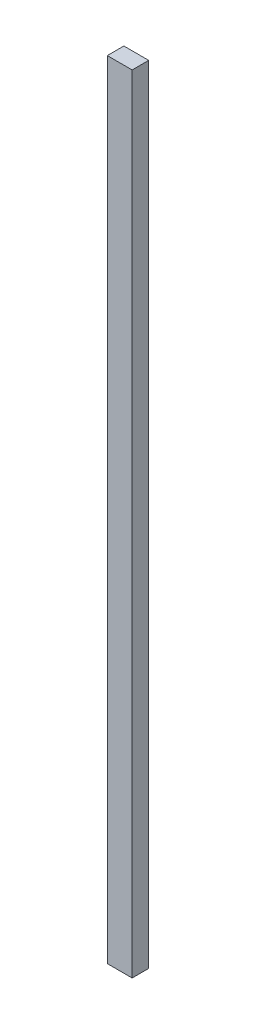
ISO-10303-21;
HEADER;
FILE_DESCRIPTION(('STEP AP214'),'2;1');
FILE_NAME('part.step','',(''),(''),'','','');
FILE_SCHEMA(('AUTOMOTIVE_DESIGN { 1 0 10303 214 1 1 1 1 }'));
ENDSEC;
DATA;
#1=APPLICATION_CONTEXT('core data for automotive mechanical design processes');
#2=APPLICATION_PROTOCOL_DEFINITION('international standard','automotive_design',2000,#1);
#3=PRODUCT_CONTEXT('',#1,'mechanical');
#4=PRODUCT('Part','Part','',(#3));
#5=PRODUCT_RELATED_PRODUCT_CATEGORY('part','',(#4));
#6=PRODUCT_DEFINITION_FORMATION('','',#4);
#7=PRODUCT_DEFINITION_CONTEXT('part definition',#1,'design');
#8=PRODUCT_DEFINITION('design','',#6,#7);
#9=PRODUCT_DEFINITION_SHAPE('','',#8);
#10=(LENGTH_UNIT() NAMED_UNIT(*) SI_UNIT(.MILLI.,.METRE.));
#11=(NAMED_UNIT(*) PLANE_ANGLE_UNIT() SI_UNIT($,.RADIAN.));
#12=(NAMED_UNIT(*) SI_UNIT($,.STERADIAN.) SOLID_ANGLE_UNIT());
#13=UNCERTAINTY_MEASURE_WITH_UNIT(LENGTH_MEASURE(1.E-05),#10,'distance_accuracy_value','');
#14=(GEOMETRIC_REPRESENTATION_CONTEXT(3) GLOBAL_UNCERTAINTY_ASSIGNED_CONTEXT((#13)) GLOBAL_UNIT_ASSIGNED_CONTEXT((#10,
#11,#12)) REPRESENTATION_CONTEXT('',''));
#15=CARTESIAN_POINT('',(0.,0.,0.));
#16=DIRECTION('',(0.,0.,1.));
#17=DIRECTION('',(1.,0.,0.));
#18=AXIS2_PLACEMENT_3D('',#15,#16,#17);
#19=CARTESIAN_POINT('',(-6.00000000000007,580.629425724373,-40.8288287657589));
#20=DIRECTION('',(1.,0.,0.));
#21=DIRECTION('',(0.,1.,0.));
#22=AXIS2_PLACEMENT_3D('',#19,#20,#21);
#23=PLANE('',#22);
#24=DIRECTION('',(0.,1.,0.));
#25=VECTOR('',#24,1.);
#26=CARTESIAN_POINT('',(-6.00000000000007,580.629425724373,-32.8288287657589));
#27=LINE('',#26,#25);
#28=CARTESIAN_POINT('',(-6.00000000000009,201.129425724218,-32.8288287657589));
#29=VERTEX_POINT('',#28);
#30=CARTESIAN_POINT('',(-6.00000000000007,580.629425724373,-32.8288287657589));
#31=VERTEX_POINT('',#30);
#32=EDGE_CURVE('E96',#29,#31,#27,.T.);
#33=ORIENTED_EDGE('',*,*,#32,.T.);
#34=DIRECTION('',(0.,0.,1.));
#35=VECTOR('',#34,1.);
#36=CARTESIAN_POINT('',(-6.00000000000007,580.629425724373,-40.8288287657589));
#37=LINE('',#36,#35);
#38=CARTESIAN_POINT('',(-6.00000000000007,580.629425724373,-40.8288287657589));
#39=VERTEX_POINT('',#38);
#40=EDGE_CURVE('E11',#39,#31,#37,.T.);
#41=ORIENTED_EDGE('',*,*,#40,.F.);
#42=DIRECTION('',(0.,1.,0.));
#43=VECTOR('',#42,1.);
#44=CARTESIAN_POINT('',(-6.00000000000007,580.629425724373,-40.8288287657589));
#45=LINE('',#44,#43);
#46=CARTESIAN_POINT('',(-6.00000000000009,201.129425724218,-40.8288287657589));
#47=VERTEX_POINT('',#46);
#48=EDGE_CURVE('E84',#47,#39,#45,.T.);
#49=ORIENTED_EDGE('',*,*,#48,.F.);
#50=DIRECTION('',(0.,0.,1.));
#51=VECTOR('',#50,1.);
#52=CARTESIAN_POINT('',(-6.00000000000009,201.129425724218,-40.8288287657589));
#53=LINE('',#52,#51);
#54=EDGE_CURVE('E92',#47,#29,#53,.T.);
#55=ORIENTED_EDGE('',*,*,#54,.T.);
#56=EDGE_LOOP('',(#33,#41,#49,#55));
#57=FACE_BOUND('',#56,.T.);
#58=ADVANCED_FACE('F33',(#57),#23,.F.);
#59=CARTESIAN_POINT('',(5.99999999999993,580.629425724373,-40.8288287657589));
#60=DIRECTION('',(0.,-1.,0.));
#61=DIRECTION('',(0.,0.,-1.));
#62=AXIS2_PLACEMENT_3D('',#59,#60,#61);
#63=PLANE('',#62);
#64=DIRECTION('',(1.,0.,0.));
#65=VECTOR('',#64,1.);
#66=CARTESIAN_POINT('',(5.99999999999993,580.629425724373,-32.8288287657589));
#67=LINE('',#66,#65);
#68=CARTESIAN_POINT('',(5.99999999999993,580.629425724373,-32.8288287657589));
#69=VERTEX_POINT('',#68);
#70=EDGE_CURVE('E88',#31,#69,#67,.T.);
#71=ORIENTED_EDGE('',*,*,#70,.T.);
#72=DIRECTION('',(0.,0.,1.));
#73=VECTOR('',#72,1.);
#74=CARTESIAN_POINT('',(5.99999999999993,580.629425724373,-40.8288287657589));
#75=LINE('',#74,#73);
#76=CARTESIAN_POINT('',(5.99999999999993,580.629425724373,-40.8288287657589));
#77=VERTEX_POINT('',#76);
#78=EDGE_CURVE('E41',#77,#69,#75,.T.);
#79=ORIENTED_EDGE('',*,*,#78,.F.);
#80=DIRECTION('',(1.,0.,0.));
#81=VECTOR('',#80,1.);
#82=CARTESIAN_POINT('',(5.99999999999993,580.629425724373,-40.8288287657589));
#83=LINE('',#82,#81);
#84=EDGE_CURVE('E79',#39,#77,#83,.T.);
#85=ORIENTED_EDGE('',*,*,#84,.F.);
#86=ORIENTED_EDGE('',*,*,#40,.T.);
#87=EDGE_LOOP('',(#71,#79,#85,#86));
#88=FACE_BOUND('',#87,.T.);
#89=ADVANCED_FACE('F87',(#88),#63,.F.);
#90=CARTESIAN_POINT('',(5.99999999999993,580.629425724373,-40.8288287657589));
#91=DIRECTION('',(-1.,0.,0.));
#92=DIRECTION('',(0.,-1.,0.));
#93=AXIS2_PLACEMENT_3D('',#90,#91,#92);
#94=PLANE('',#93);
#95=DIRECTION('',(0.,-1.,0.));
#96=VECTOR('',#95,1.);
#97=CARTESIAN_POINT('',(5.99999999999993,580.629425724373,-32.8288287657589));
#98=LINE('',#97,#96);
#99=CARTESIAN_POINT('',(5.99999999999991,201.129425724218,-32.8288287657589));
#100=VERTEX_POINT('',#99);
#101=EDGE_CURVE('E66',#69,#100,#98,.T.);
#102=ORIENTED_EDGE('',*,*,#101,.T.);
#103=DIRECTION('',(0.,0.,1.));
#104=VECTOR('',#103,1.);
#105=CARTESIAN_POINT('',(5.99999999999991,201.129425724218,-40.8288287657589));
#106=LINE('',#105,#104);
#107=CARTESIAN_POINT('',(5.99999999999991,201.129425724218,-40.8288287657589));
#108=VERTEX_POINT('',#107);
#109=EDGE_CURVE('E89',#108,#100,#106,.T.);
#110=ORIENTED_EDGE('',*,*,#109,.F.);
#111=DIRECTION('',(0.,-1.,0.));
#112=VECTOR('',#111,1.);
#113=CARTESIAN_POINT('',(5.99999999999993,580.629425724373,-40.8288287657589));
#114=LINE('',#113,#112);
#115=EDGE_CURVE('E82',#77,#108,#114,.T.);
#116=ORIENTED_EDGE('',*,*,#115,.F.);
#117=ORIENTED_EDGE('',*,*,#78,.T.);
#118=EDGE_LOOP('',(#102,#110,#116,#117));
#119=FACE_BOUND('',#118,.T.);
#120=ADVANCED_FACE('F90',(#119),#94,.F.);
#121=CARTESIAN_POINT('',(5.99999999999991,201.129425724218,-40.8288287657589));
#122=DIRECTION('',(0.,1.,0.));
#123=DIRECTION('',(0.,0.,1.));
#124=AXIS2_PLACEMENT_3D('',#121,#122,#123);
#125=PLANE('',#124);
#126=DIRECTION('',(-1.,0.,0.));
#127=VECTOR('',#126,1.);
#128=CARTESIAN_POINT('',(5.99999999999991,201.129425724218,-32.8288287657589));
#129=LINE('',#128,#127);
#130=EDGE_CURVE('E72',#100,#29,#129,.T.);
#131=ORIENTED_EDGE('',*,*,#130,.T.);
#132=ORIENTED_EDGE('',*,*,#54,.F.);
#133=DIRECTION('',(-1.,0.,0.));
#134=VECTOR('',#133,1.);
#135=CARTESIAN_POINT('',(5.99999999999991,201.129425724218,-40.8288287657589));
#136=LINE('',#135,#134);
#137=EDGE_CURVE('E49',#108,#47,#136,.T.);
#138=ORIENTED_EDGE('',*,*,#137,.F.);
#139=ORIENTED_EDGE('',*,*,#109,.T.);
#140=EDGE_LOOP('',(#131,#132,#138,#139));
#141=FACE_BOUND('',#140,.T.);
#142=ADVANCED_FACE('F103',(#141),#125,.F.);
#143=CARTESIAN_POINT('',(0.,0.,-40.8288287657589));
#144=DIRECTION('',(0.,0.,-1.));
#145=DIRECTION('',(0.,1.,0.));
#146=AXIS2_PLACEMENT_3D('',#143,#144,#145);
#147=PLANE('',#146);
#148=ORIENTED_EDGE('',*,*,#48,.T.);
#149=ORIENTED_EDGE('',*,*,#84,.T.);
#150=ORIENTED_EDGE('',*,*,#115,.T.);
#151=ORIENTED_EDGE('',*,*,#137,.T.);
#152=EDGE_LOOP('',(#148,#149,#150,#151));
#153=FACE_BOUND('',#152,.T.);
#154=ADVANCED_FACE('F80',(#153),#147,.T.);
#155=CARTESIAN_POINT('',(0.,0.,-32.8288287657589));
#156=DIRECTION('',(0.,0.,-1.));
#157=DIRECTION('',(0.,1.,0.));
#158=AXIS2_PLACEMENT_3D('',#155,#156,#157);
#159=PLANE('',#158);
#160=ORIENTED_EDGE('',*,*,#32,.F.);
#161=ORIENTED_EDGE('',*,*,#130,.F.);
#162=ORIENTED_EDGE('',*,*,#101,.F.);
#163=ORIENTED_EDGE('',*,*,#70,.F.);
#164=EDGE_LOOP('',(#160,#161,#162,#163));
#165=FACE_BOUND('',#164,.T.);
#166=ADVANCED_FACE('F106',(#165),#159,.F.);
#167=CLOSED_SHELL('',(#58,#89,#120,#142,#154,#166));
#168=MANIFOLD_SOLID_BREP('B2',#167);
#169=ADVANCED_BREP_SHAPE_REPRESENTATION('',(#18,#168),#14);
#170=SHAPE_DEFINITION_REPRESENTATION(#9,#169);
ENDSEC;
END-ISO-10303-21;
